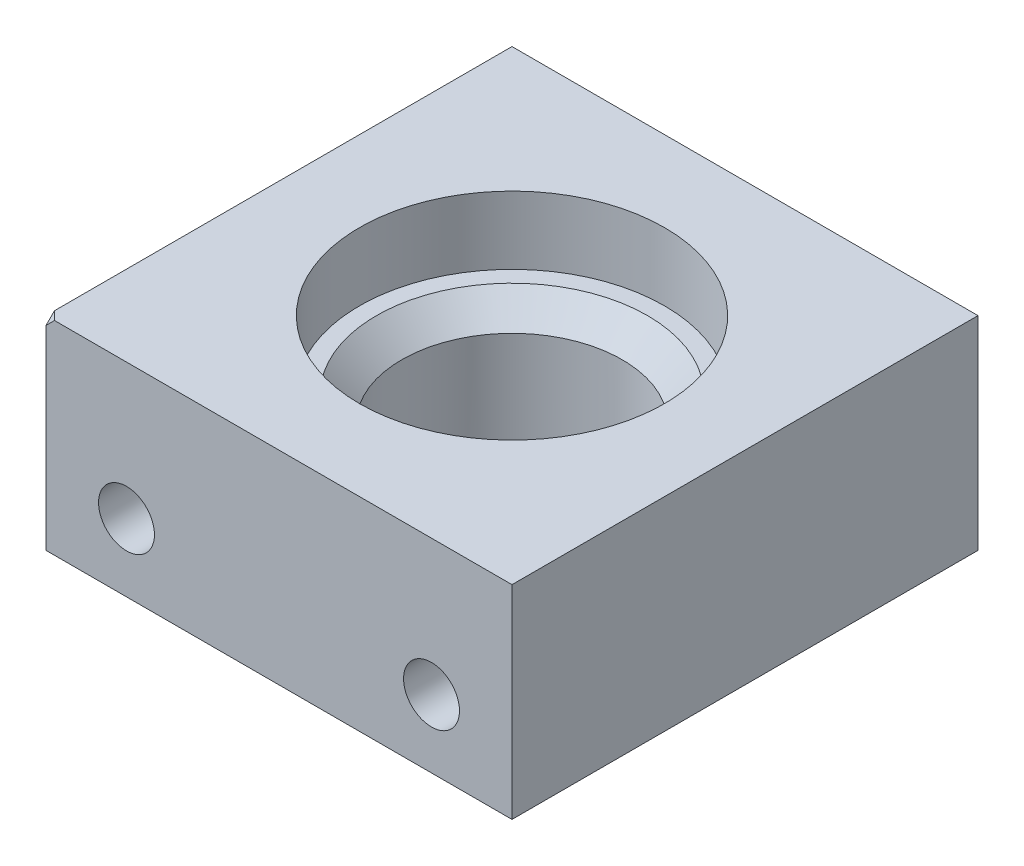
ISO-10303-21;
HEADER;
FILE_DESCRIPTION(('STEP AP214'),'2;1');
FILE_NAME('part.step','',(''),(''),'','','');
FILE_SCHEMA(('AUTOMOTIVE_DESIGN { 1 0 10303 214 1 1 1 1 }'));
ENDSEC;
DATA;
#1=APPLICATION_CONTEXT('core data for automotive mechanical design processes');
#2=APPLICATION_PROTOCOL_DEFINITION('international standard','automotive_design',2000,#1);
#3=PRODUCT_CONTEXT('',#1,'mechanical');
#4=PRODUCT('Part','Part','',(#3));
#5=PRODUCT_RELATED_PRODUCT_CATEGORY('part','',(#4));
#6=PRODUCT_DEFINITION_FORMATION('','',#4);
#7=PRODUCT_DEFINITION_CONTEXT('part definition',#1,'design');
#8=PRODUCT_DEFINITION('design','',#6,#7);
#9=PRODUCT_DEFINITION_SHAPE('','',#8);
#10=(LENGTH_UNIT() NAMED_UNIT(*) SI_UNIT(.MILLI.,.METRE.));
#11=(NAMED_UNIT(*) PLANE_ANGLE_UNIT() SI_UNIT($,.RADIAN.));
#12=(NAMED_UNIT(*) SI_UNIT($,.STERADIAN.) SOLID_ANGLE_UNIT());
#13=UNCERTAINTY_MEASURE_WITH_UNIT(LENGTH_MEASURE(1.E-05),#10,'distance_accuracy_value','');
#14=(GEOMETRIC_REPRESENTATION_CONTEXT(3) GLOBAL_UNCERTAINTY_ASSIGNED_CONTEXT((#13)) GLOBAL_UNIT_ASSIGNED_CONTEXT((#10,
#11,#12)) REPRESENTATION_CONTEXT('',''));
#15=CARTESIAN_POINT('',(0.,0.,0.));
#16=DIRECTION('',(0.,0.,1.));
#17=DIRECTION('',(1.,0.,0.));
#18=AXIS2_PLACEMENT_3D('',#15,#16,#17);
#19=CARTESIAN_POINT('',(13.75,12.,13.75));
#20=DIRECTION('',(-1.,0.,0.));
#21=DIRECTION('',(0.,0.,1.));
#22=AXIS2_PLACEMENT_3D('',#19,#20,#21);
#23=PLANE('',#22);
#24=DIRECTION('',(0.,0.,-1.));
#25=VECTOR('',#24,1.);
#26=CARTESIAN_POINT('',(13.75,0.,13.75));
#27=LINE('',#26,#25);
#28=CARTESIAN_POINT('',(13.75,0.,13.75));
#29=VERTEX_POINT('',#28);
#30=CARTESIAN_POINT('',(13.75,0.,-13.75));
#31=VERTEX_POINT('',#30);
#32=EDGE_CURVE('E119',#29,#31,#27,.T.);
#33=ORIENTED_EDGE('',*,*,#32,.T.);
#34=DIRECTION('',(0.,-1.,0.));
#35=VECTOR('',#34,1.);
#36=CARTESIAN_POINT('',(13.75,12.,-13.75));
#37=LINE('',#36,#35);
#38=CARTESIAN_POINT('',(13.75,12.,-13.75));
#39=VERTEX_POINT('',#38);
#40=EDGE_CURVE('E103',#39,#31,#37,.T.);
#41=ORIENTED_EDGE('',*,*,#40,.F.);
#42=DIRECTION('',(0.,0.,-1.));
#43=VECTOR('',#42,1.);
#44=CARTESIAN_POINT('',(13.75,12.,13.75));
#45=LINE('',#44,#43);
#46=CARTESIAN_POINT('',(13.75,12.,13.75));
#47=VERTEX_POINT('',#46);
#48=EDGE_CURVE('E114',#47,#39,#45,.T.);
#49=ORIENTED_EDGE('',*,*,#48,.F.);
#50=DIRECTION('',(0.,-1.,0.));
#51=VECTOR('',#50,1.);
#52=CARTESIAN_POINT('',(13.75,12.,13.75));
#53=LINE('',#52,#51);
#54=EDGE_CURVE('E109',#47,#29,#53,.T.);
#55=ORIENTED_EDGE('',*,*,#54,.T.);
#56=EDGE_LOOP('',(#33,#41,#49,#55));
#57=FACE_BOUND('',#56,.T.);
#58=ADVANCED_FACE('F35',(#57),#23,.F.);
#59=CARTESIAN_POINT('',(-13.75,12.,-13.75));
#60=DIRECTION('',(0.,0.,1.));
#61=DIRECTION('',(1.,0.,0.));
#62=AXIS2_PLACEMENT_3D('',#59,#60,#61);
#63=PLANE('',#62);
#64=CARTESIAN_POINT('',(-9.,4.,-13.75));
#65=DIRECTION('',(0.,0.,1.));
#66=DIRECTION('',(1.,0.,0.));
#67=AXIS2_PLACEMENT_3D('',#64,#65,#66);
#68=CIRCLE('',#67,1.65);
#69=CARTESIAN_POINT('',(-7.35,4.,-13.75));
#70=VERTEX_POINT('',#69);
#71=EDGE_CURVE('E134',#70,#70,#68,.F.);
#72=ORIENTED_EDGE('',*,*,#71,.F.);
#73=EDGE_LOOP('',(#72));
#74=FACE_BOUND('',#73,.T.);
#75=CARTESIAN_POINT('',(9.,4.,-13.75));
#76=DIRECTION('',(0.,0.,1.));
#77=DIRECTION('',(1.,0.,0.));
#78=AXIS2_PLACEMENT_3D('',#75,#76,#77);
#79=CIRCLE('',#78,1.65);
#80=CARTESIAN_POINT('',(10.65,4.,-13.75));
#81=VERTEX_POINT('',#80);
#82=EDGE_CURVE('E135',#81,#81,#79,.F.);
#83=ORIENTED_EDGE('',*,*,#82,.F.);
#84=EDGE_LOOP('',(#83));
#85=FACE_BOUND('',#84,.T.);
#86=DIRECTION('',(-1.,0.,0.));
#87=VECTOR('',#86,1.);
#88=CARTESIAN_POINT('',(-13.75,0.,-13.75));
#89=LINE('',#88,#87);
#90=CARTESIAN_POINT('',(-13.75,0.,-13.75));
#91=VERTEX_POINT('',#90);
#92=EDGE_CURVE('E117',#31,#91,#89,.T.);
#93=ORIENTED_EDGE('',*,*,#92,.T.);
#94=DIRECTION('',(0.,-1.,0.));
#95=VECTOR('',#94,1.);
#96=CARTESIAN_POINT('',(-13.75,12.,-13.75));
#97=LINE('',#96,#95);
#98=CARTESIAN_POINT('',(-13.75,12.,-13.75));
#99=VERTEX_POINT('',#98);
#100=EDGE_CURVE('E106',#99,#91,#97,.T.);
#101=ORIENTED_EDGE('',*,*,#100,.F.);
#102=DIRECTION('',(-1.,0.,0.));
#103=VECTOR('',#102,1.);
#104=CARTESIAN_POINT('',(-13.75,12.,-13.75));
#105=LINE('',#104,#103);
#106=EDGE_CURVE('E82',#39,#99,#105,.T.);
#107=ORIENTED_EDGE('',*,*,#106,.F.);
#108=ORIENTED_EDGE('',*,*,#40,.T.);
#109=EDGE_LOOP('',(#93,#101,#107,#108));
#110=FACE_BOUND('',#109,.T.);
#111=ADVANCED_FACE('F163',(#74,#85,#110),#63,.F.);
#112=CARTESIAN_POINT('',(-13.75,12.,13.75));
#113=DIRECTION('',(1.,0.,0.));
#114=DIRECTION('',(0.,0.,-1.));
#115=AXIS2_PLACEMENT_3D('',#112,#113,#114);
#116=PLANE('',#115);
#117=DIRECTION('',(0.,-0.707106781186547,0.707106781186547));
#118=VECTOR('',#117,1.);
#119=CARTESIAN_POINT('',(-13.75,11.75,13.5));
#120=LINE('',#119,#118);
#121=CARTESIAN_POINT('',(-13.75,12.,13.25));
#122=VERTEX_POINT('',#121);
#123=CARTESIAN_POINT('',(-13.75,11.5,13.75));
#124=VERTEX_POINT('',#123);
#125=EDGE_CURVE('E89',#122,#124,#120,.T.);
#126=ORIENTED_EDGE('',*,*,#125,.F.);
#127=DIRECTION('',(0.,0.,1.));
#128=VECTOR('',#127,1.);
#129=CARTESIAN_POINT('',(-13.75,12.,13.75));
#130=LINE('',#129,#128);
#131=EDGE_CURVE('E77',#99,#122,#130,.T.);
#132=ORIENTED_EDGE('',*,*,#131,.F.);
#133=ORIENTED_EDGE('',*,*,#100,.T.);
#134=DIRECTION('',(0.,0.,1.));
#135=VECTOR('',#134,1.);
#136=CARTESIAN_POINT('',(-13.75,0.,13.75));
#137=LINE('',#136,#135);
#138=CARTESIAN_POINT('',(-13.75,0.,13.75));
#139=VERTEX_POINT('',#138);
#140=EDGE_CURVE('E115',#91,#139,#137,.T.);
#141=ORIENTED_EDGE('',*,*,#140,.T.);
#142=DIRECTION('',(0.,-1.,0.));
#143=VECTOR('',#142,1.);
#144=CARTESIAN_POINT('',(-13.75,12.,13.75));
#145=LINE('',#144,#143);
#146=EDGE_CURVE('E92',#124,#139,#145,.T.);
#147=ORIENTED_EDGE('',*,*,#146,.F.);
#148=EDGE_LOOP('',(#126,#132,#133,#141,#147));
#149=FACE_BOUND('',#148,.T.);
#150=ADVANCED_FACE('F90',(#149),#116,.F.);
#151=CARTESIAN_POINT('',(-13.75,12.,13.75));
#152=DIRECTION('',(0.,0.,-1.));
#153=DIRECTION('',(-1.,0.,0.));
#154=AXIS2_PLACEMENT_3D('',#151,#152,#153);
#155=PLANE('',#154);
#156=DIRECTION('',(0.707106781186547,0.707106781186547,0.));
#157=VECTOR('',#156,1.);
#158=CARTESIAN_POINT('',(-13.5,11.75,13.75));
#159=LINE('',#158,#157);
#160=CARTESIAN_POINT('',(-13.25,12.,13.75));
#161=VERTEX_POINT('',#160);
#162=EDGE_CURVE('E43',#124,#161,#159,.T.);
#163=ORIENTED_EDGE('',*,*,#162,.F.);
#164=ORIENTED_EDGE('',*,*,#146,.T.);
#165=DIRECTION('',(1.,0.,0.));
#166=VECTOR('',#165,1.);
#167=CARTESIAN_POINT('',(-13.75,0.,13.75));
#168=LINE('',#167,#166);
#169=EDGE_CURVE('E112',#139,#29,#168,.T.);
#170=ORIENTED_EDGE('',*,*,#169,.T.);
#171=ORIENTED_EDGE('',*,*,#54,.F.);
#172=DIRECTION('',(1.,0.,0.));
#173=VECTOR('',#172,1.);
#174=CARTESIAN_POINT('',(-13.75,12.,13.75));
#175=LINE('',#174,#173);
#176=EDGE_CURVE('E86',#161,#47,#175,.T.);
#177=ORIENTED_EDGE('',*,*,#176,.F.);
#178=EDGE_LOOP('',(#163,#164,#170,#171,#177));
#179=FACE_BOUND('',#178,.T.);
#180=CARTESIAN_POINT('',(-9.,4.,13.75));
#181=DIRECTION('',(0.,0.,1.));
#182=DIRECTION('',(1.,0.,0.));
#183=AXIS2_PLACEMENT_3D('',#180,#181,#182);
#184=CIRCLE('',#183,1.65);
#185=CARTESIAN_POINT('',(-7.35,4.,13.75));
#186=VERTEX_POINT('',#185);
#187=EDGE_CURVE('E138',#186,#186,#184,.T.);
#188=ORIENTED_EDGE('',*,*,#187,.F.);
#189=EDGE_LOOP('',(#188));
#190=FACE_BOUND('',#189,.T.);
#191=CARTESIAN_POINT('',(9.,4.,13.75));
#192=DIRECTION('',(0.,0.,1.));
#193=DIRECTION('',(1.,0.,0.));
#194=AXIS2_PLACEMENT_3D('',#191,#192,#193);
#195=CIRCLE('',#194,1.65);
#196=CARTESIAN_POINT('',(10.65,4.,13.75));
#197=VERTEX_POINT('',#196);
#198=EDGE_CURVE('E139',#197,#197,#195,.T.);
#199=ORIENTED_EDGE('',*,*,#198,.F.);
#200=EDGE_LOOP('',(#199));
#201=FACE_BOUND('',#200,.T.);
#202=ADVANCED_FACE('F150',(#179,#190,#201),#155,.F.);
#203=CARTESIAN_POINT('',(0.,12.,0.));
#204=DIRECTION('',(0.,-1.,0.));
#205=DIRECTION('',(0.,0.,-1.));
#206=AXIS2_PLACEMENT_3D('',#203,#204,#205);
#207=PLANE('',#206);
#208=DIRECTION('',(-0.707106781186547,0.,-0.707106781186547));
#209=VECTOR('',#208,1.);
#210=CARTESIAN_POINT('',(-13.5,12.,13.5));
#211=LINE('',#210,#209);
#212=EDGE_CURVE('E11',#161,#122,#211,.T.);
#213=ORIENTED_EDGE('',*,*,#212,.F.);
#214=ORIENTED_EDGE('',*,*,#176,.T.);
#215=ORIENTED_EDGE('',*,*,#48,.T.);
#216=ORIENTED_EDGE('',*,*,#106,.T.);
#217=ORIENTED_EDGE('',*,*,#131,.T.);
#218=EDGE_LOOP('',(#213,#214,#215,#216,#217));
#219=FACE_BOUND('',#218,.T.);
#220=CARTESIAN_POINT('',(0.,12.,0.));
#221=DIRECTION('',(0.,1.,0.));
#222=DIRECTION('',(0.,0.,1.));
#223=AXIS2_PLACEMENT_3D('',#220,#221,#222);
#224=CIRCLE('',#223,9.);
#225=CARTESIAN_POINT('',(0.,12.,9.));
#226=VERTEX_POINT('',#225);
#227=EDGE_CURVE('E126',#226,#226,#224,.T.);
#228=ORIENTED_EDGE('',*,*,#227,.F.);
#229=EDGE_LOOP('',(#228));
#230=FACE_BOUND('',#229,.T.);
#231=ADVANCED_FACE('F79',(#219,#230),#207,.F.);
#232=CARTESIAN_POINT('',(0.,0.,0.));
#233=DIRECTION('',(0.,-1.,0.));
#234=DIRECTION('',(0.,0.,-1.));
#235=AXIS2_PLACEMENT_3D('',#232,#233,#234);
#236=PLANE('',#235);
#237=CARTESIAN_POINT('',(0.,0.,0.));
#238=DIRECTION('',(0.,-1.,0.));
#239=DIRECTION('',(0.,0.,-1.));
#240=AXIS2_PLACEMENT_3D('',#237,#238,#239);
#241=CIRCLE('',#240,6.5);
#242=CARTESIAN_POINT('',(0.,0.,-6.5));
#243=VERTEX_POINT('',#242);
#244=EDGE_CURVE('E129',#243,#243,#241,.F.);
#245=ORIENTED_EDGE('',*,*,#244,.T.);
#246=EDGE_LOOP('',(#245));
#247=FACE_BOUND('',#246,.T.);
#248=ORIENTED_EDGE('',*,*,#32,.F.);
#249=ORIENTED_EDGE('',*,*,#169,.F.);
#250=ORIENTED_EDGE('',*,*,#140,.F.);
#251=ORIENTED_EDGE('',*,*,#92,.F.);
#252=EDGE_LOOP('',(#248,#249,#250,#251));
#253=FACE_BOUND('',#252,.T.);
#254=ADVANCED_FACE('F173',(#247,#253),#236,.T.);
#255=CARTESIAN_POINT('',(0.,8.,0.));
#256=DIRECTION('',(0.,1.,0.));
#257=DIRECTION('',(0.,0.,1.));
#258=AXIS2_PLACEMENT_3D('',#255,#256,#257);
#259=CYLINDRICAL_SURFACE('',#258,9.);
#260=CARTESIAN_POINT('',(0.,8.,0.));
#261=DIRECTION('',(0.,1.,0.));
#262=DIRECTION('',(0.,0.,1.));
#263=AXIS2_PLACEMENT_3D('',#260,#261,#262);
#264=CIRCLE('',#263,9.);
#265=CARTESIAN_POINT('',(0.,8.,9.));
#266=VERTEX_POINT('',#265);
#267=EDGE_CURVE('E122',#266,#266,#264,.T.);
#268=ORIENTED_EDGE('',*,*,#267,.F.);
#269=EDGE_LOOP('',(#268));
#270=FACE_BOUND('',#269,.T.);
#271=ORIENTED_EDGE('',*,*,#227,.T.);
#272=EDGE_LOOP('',(#271));
#273=FACE_BOUND('',#272,.T.);
#274=ADVANCED_FACE('F185',(#270,#273),#259,.F.);
#275=CARTESIAN_POINT('',(0.,8.,0.));
#276=DIRECTION('',(0.,1.,0.));
#277=DIRECTION('',(0.,0.,1.));
#278=AXIS2_PLACEMENT_3D('',#275,#276,#277);
#279=PLANE('',#278);
#280=CARTESIAN_POINT('',(0.,8.,0.));
#281=DIRECTION('',(0.,1.,0.));
#282=DIRECTION('',(0.,0.,1.));
#283=AXIS2_PLACEMENT_3D('',#280,#281,#282);
#284=CIRCLE('',#283,8.00000000000001);
#285=CARTESIAN_POINT('',(0.,8.,8.00000000000001));
#286=VERTEX_POINT('',#285);
#287=EDGE_CURVE('E94',#286,#286,#284,.F.);
#288=ORIENTED_EDGE('',*,*,#287,.T.);
#289=EDGE_LOOP('',(#288));
#290=FACE_BOUND('',#289,.T.);
#291=ORIENTED_EDGE('',*,*,#267,.T.);
#292=EDGE_LOOP('',(#291));
#293=FACE_BOUND('',#292,.T.);
#294=ADVANCED_FACE('F191',(#290,#293),#279,.T.);
#295=CARTESIAN_POINT('',(0.,-0.000999999999999265,0.));
#296=DIRECTION('',(0.,1.,0.));
#297=DIRECTION('',(0.,0.,1.));
#298=AXIS2_PLACEMENT_3D('',#295,#296,#297);
#299=CYLINDRICAL_SURFACE('',#298,6.5);
#300=CARTESIAN_POINT('',(0.,6.5,0.));
#301=DIRECTION('',(0.,1.,0.));
#302=DIRECTION('',(0.,0.,1.));
#303=AXIS2_PLACEMENT_3D('',#300,#301,#302);
#304=CIRCLE('',#303,6.5);
#305=CARTESIAN_POINT('',(0.,6.5,6.5));
#306=VERTEX_POINT('',#305);
#307=EDGE_CURVE('E100',#306,#306,#304,.T.);
#308=ORIENTED_EDGE('',*,*,#307,.T.);
#309=EDGE_LOOP('',(#308));
#310=FACE_BOUND('',#309,.T.);
#311=ORIENTED_EDGE('',*,*,#244,.F.);
#312=EDGE_LOOP('',(#311));
#313=FACE_BOUND('',#312,.T.);
#314=ADVANCED_FACE('F159',(#310,#313),#299,.F.);
#315=CARTESIAN_POINT('',(9.,4.,-13.751));
#316=DIRECTION('',(0.,0.,1.));
#317=DIRECTION('',(1.,0.,0.));
#318=AXIS2_PLACEMENT_3D('',#315,#316,#317);
#319=CYLINDRICAL_SURFACE('',#318,1.65);
#320=ORIENTED_EDGE('',*,*,#198,.T.);
#321=EDGE_LOOP('',(#320));
#322=FACE_BOUND('',#321,.T.);
#323=ORIENTED_EDGE('',*,*,#82,.T.);
#324=EDGE_LOOP('',(#323));
#325=FACE_BOUND('',#324,.T.);
#326=ADVANCED_FACE('F156',(#322,#325),#319,.F.);
#327=CARTESIAN_POINT('',(-9.,4.,-13.751));
#328=DIRECTION('',(0.,0.,1.));
#329=DIRECTION('',(1.,0.,0.));
#330=AXIS2_PLACEMENT_3D('',#327,#328,#329);
#331=CYLINDRICAL_SURFACE('',#330,1.65);
#332=ORIENTED_EDGE('',*,*,#187,.T.);
#333=EDGE_LOOP('',(#332));
#334=FACE_BOUND('',#333,.T.);
#335=ORIENTED_EDGE('',*,*,#71,.T.);
#336=EDGE_LOOP('',(#335));
#337=FACE_BOUND('',#336,.T.);
#338=ADVANCED_FACE('F147',(#334,#337),#331,.F.);
#339=CARTESIAN_POINT('',(0.,6.5,0.));
#340=DIRECTION('',(0.,1.,0.));
#341=DIRECTION('',(0.,0.,1.));
#342=AXIS2_PLACEMENT_3D('',#339,#340,#341);
#343=CONICAL_SURFACE('',#342,6.5,0.785398163397451);
#344=ORIENTED_EDGE('',*,*,#287,.F.);
#345=EDGE_LOOP('',(#344));
#346=FACE_BOUND('',#345,.T.);
#347=ORIENTED_EDGE('',*,*,#307,.F.);
#348=EDGE_LOOP('',(#347));
#349=FACE_BOUND('',#348,.T.);
#350=ADVANCED_FACE('F37',(#346,#349),#343,.F.);
#351=CARTESIAN_POINT('',(-13.,13.,13.));
#352=DIRECTION('',(-0.577350269189626,0.577350269189626,0.577350269189626));
#353=DIRECTION('',(0.707106781186547,0.,0.707106781186547));
#354=AXIS2_PLACEMENT_3D('',#351,#352,#353);
#355=PLANE('',#354);
#356=ORIENTED_EDGE('',*,*,#212,.T.);
#357=ORIENTED_EDGE('',*,*,#125,.T.);
#358=ORIENTED_EDGE('',*,*,#162,.T.);
#359=EDGE_LOOP('',(#356,#357,#358));
#360=FACE_BOUND('',#359,.T.);
#361=ADVANCED_FACE('F96',(#360),#355,.T.);
#362=CLOSED_SHELL('',(#58,#111,#150,#202,#231,#254,#274,#294,#314,#326,#338,#350,#361));
#363=MANIFOLD_SOLID_BREP('B2',#362);
#364=ADVANCED_BREP_SHAPE_REPRESENTATION('',(#18,#363),#14);
#365=SHAPE_DEFINITION_REPRESENTATION(#9,#364);
ENDSEC;
END-ISO-10303-21;
